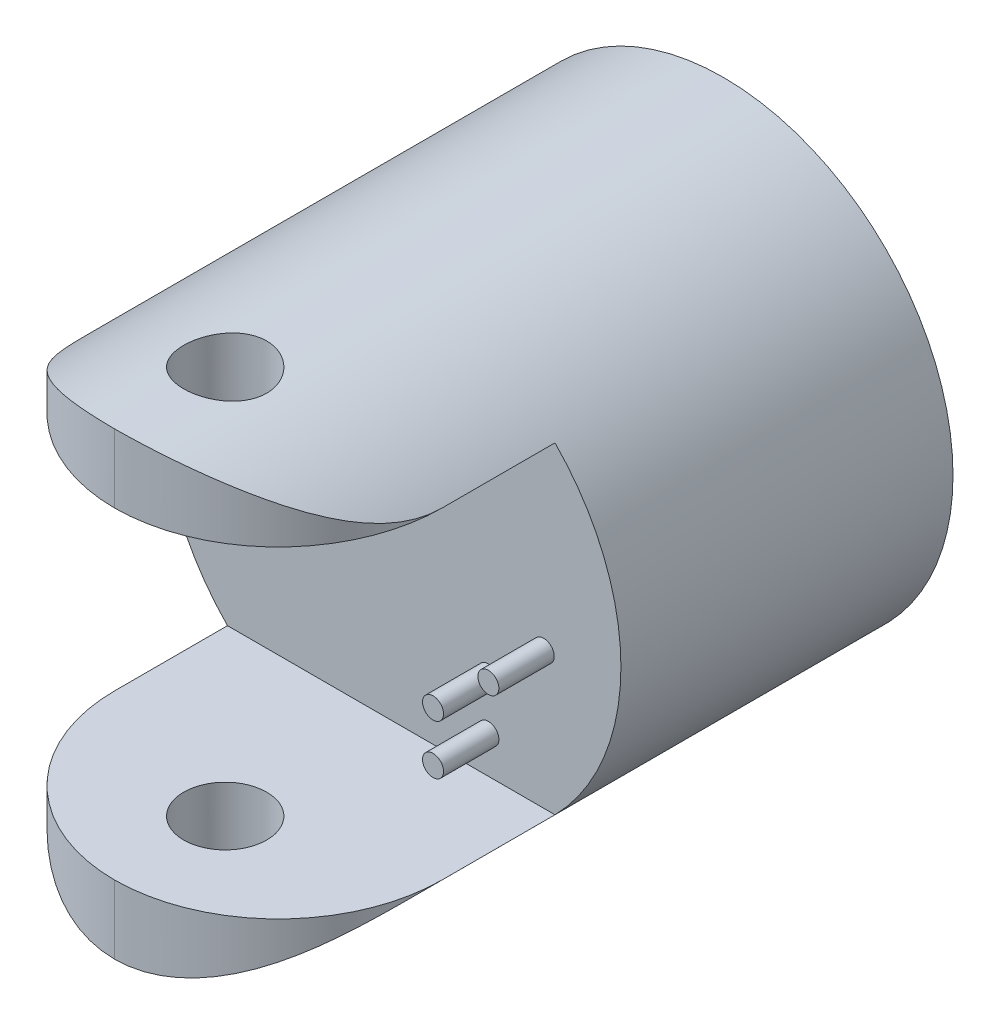
ISO-10303-21;
HEADER;
FILE_DESCRIPTION(('STEP AP214'),'2;1');
FILE_NAME('part.step','',(''),(''),'','','');
FILE_SCHEMA(('AUTOMOTIVE_DESIGN { 1 0 10303 214 1 1 1 1 }'));
ENDSEC;
DATA;
#1=APPLICATION_CONTEXT('core data for automotive mechanical design processes');
#2=APPLICATION_PROTOCOL_DEFINITION('international standard','automotive_design',2000,#1);
#3=PRODUCT_CONTEXT('',#1,'mechanical');
#4=PRODUCT('Part','Part','',(#3));
#5=PRODUCT_RELATED_PRODUCT_CATEGORY('part','',(#4));
#6=PRODUCT_DEFINITION_FORMATION('','',#4);
#7=PRODUCT_DEFINITION_CONTEXT('part definition',#1,'design');
#8=PRODUCT_DEFINITION('design','',#6,#7);
#9=PRODUCT_DEFINITION_SHAPE('','',#8);
#10=(LENGTH_UNIT() NAMED_UNIT(*) SI_UNIT(.MILLI.,.METRE.));
#11=(NAMED_UNIT(*) PLANE_ANGLE_UNIT() SI_UNIT($,.RADIAN.));
#12=(NAMED_UNIT(*) SI_UNIT($,.STERADIAN.) SOLID_ANGLE_UNIT());
#13=UNCERTAINTY_MEASURE_WITH_UNIT(LENGTH_MEASURE(1.E-05),#10,'distance_accuracy_value','');
#14=(GEOMETRIC_REPRESENTATION_CONTEXT(3) GLOBAL_UNCERTAINTY_ASSIGNED_CONTEXT((#13)) GLOBAL_UNIT_ASSIGNED_CONTEXT((#10,
#11,#12)) REPRESENTATION_CONTEXT('',''));
#15=CARTESIAN_POINT('',(0.,0.,0.));
#16=DIRECTION('',(0.,0.,1.));
#17=DIRECTION('',(1.,0.,0.));
#18=AXIS2_PLACEMENT_3D('',#15,#16,#17);
#19=CARTESIAN_POINT('',(0.,0.,11.));
#20=DIRECTION('',(0.,0.,-1.));
#21=DIRECTION('',(-1.,0.,0.));
#22=AXIS2_PLACEMENT_3D('',#19,#20,#21);
#23=CYLINDRICAL_SURFACE('',#22,4.15);
#24=CARTESIAN_POINT('',(0.,-4.15,9.75));
#25=CARTESIAN_POINT('',(0.0417633529160029,-4.14999925457705,9.74999837595521));
#26=CARTESIAN_POINT('',(0.0835481573998624,-4.14936304566028,9.74649985761465));
#27=CARTESIAN_POINT('',(0.16594216285283,-4.14688638329894,9.73260615082788));
#28=CARTESIAN_POINT('',(0.206550309547093,-4.1450448827657,9.72220496562846));
#29=CARTESIAN_POINT('',(0.28538732379447,-4.14036381959375,9.69483327201025));
#30=CARTESIAN_POINT('',(0.323618238312349,-4.13752513001491,9.67786850882844));
#31=CARTESIAN_POINT('',(0.396687083534481,-4.13116039085345,9.6378671193461));
#32=CARTESIAN_POINT('',(0.431525326466942,-4.12763440461269,9.61483105251337));
#33=CARTESIAN_POINT('',(0.497212752770685,-4.12024082002977,9.56306781875255));
#34=CARTESIAN_POINT('',(0.528018581262237,-4.11637015929579,9.53428606624225));
#35=CARTESIAN_POINT('',(0.584391836857417,-4.10874643945675,9.4719659209259));
#36=CARTESIAN_POINT('',(0.609958903650842,-4.10499338845566,9.43842720121465));
#37=CARTESIAN_POINT('',(0.655307004822626,-4.09800010398338,9.36724163364887));
#38=CARTESIAN_POINT('',(0.675044348833567,-4.09476382236178,9.32956653095574));
#39=CARTESIAN_POINT('',(0.707893147721324,-4.08921344318258,9.2513670975097));
#40=CARTESIAN_POINT('',(0.72100513173539,-4.08689927198336,9.210842994588));
#41=CARTESIAN_POINT('',(0.740092715047396,-4.08348585189574,9.12855837822476));
#42=CARTESIAN_POINT('',(0.746143674851663,-4.08237378289001,9.08681588836988));
#43=CARTESIAN_POINT('',(0.751171273723279,-4.08145178788948,9.00289445006508));
#44=CARTESIAN_POINT('',(0.750148501724098,-4.08164175349194,8.96071553824202));
#45=CARTESIAN_POINT('',(0.741118870093994,-4.08329068038666,8.87766181100847));
#46=CARTESIAN_POINT('',(0.733197351083193,-4.08473413483305,8.83677736421685));
#47=CARTESIAN_POINT('',(0.71072932815388,-4.08870307040237,8.75692749059363));
#48=CARTESIAN_POINT('',(0.696182560914899,-4.09122859453191,8.71796214010472));
#49=CARTESIAN_POINT('',(0.66079248216571,-4.0970935000125,8.64280489159885));
#50=CARTESIAN_POINT('',(0.639914382004487,-4.10043735773864,8.60662973859554));
#51=CARTESIAN_POINT('',(0.592478925197906,-4.10755915402166,8.53826398939631));
#52=CARTESIAN_POINT('',(0.565921031850152,-4.11133713358454,8.5060737702041));
#53=CARTESIAN_POINT('',(0.507418107741395,-4.11896925292661,8.44609825953213));
#54=CARTESIAN_POINT('',(0.475400004374248,-4.1228236987261,8.41838423611932));
#55=CARTESIAN_POINT('',(0.407130932089405,-4.1301236018889,8.36871051358903));
#56=CARTESIAN_POINT('',(0.370879926253039,-4.13356905568453,8.34675086466565));
#57=CARTESIAN_POINT('',(0.295102220395709,-4.13966899106462,8.30920011019317));
#58=CARTESIAN_POINT('',(0.255571959647319,-4.14232259807895,8.29361603927841));
#59=CARTESIAN_POINT('',(0.174396233387298,-4.14653301374088,8.26932886328801));
#60=CARTESIAN_POINT('',(0.132750976816927,-4.14808993050584,8.26062507990791));
#61=CARTESIAN_POINT('',(0.0491409343128916,-4.14991679826833,8.25044387087086));
#62=CARTESIAN_POINT('',(0.00718841417311272,-4.15020414959385,8.24886873451339));
#63=CARTESIAN_POINT('',(-0.0763806989520892,-4.14950743742769,8.25272797273135));
#64=CARTESIAN_POINT('',(-0.117997307138798,-4.148523431798,8.25816202830443));
#65=CARTESIAN_POINT('',(-0.199406067096915,-4.14540538188906,8.27580414376078));
#66=CARTESIAN_POINT('',(-0.23920920244161,-4.14327967354819,8.28796312174709));
#67=CARTESIAN_POINT('',(-0.316212040501872,-4.13811557383498,8.3186570869092));
#68=CARTESIAN_POINT('',(-0.353411576237733,-4.13507712399073,8.33719248258114));
#69=CARTESIAN_POINT('',(-0.424570777688059,-4.12838120904228,8.38033192813667));
#70=CARTESIAN_POINT('',(-0.458493397504219,-4.12471772814357,8.40499613335158));
#71=CARTESIAN_POINT('',(-0.521753274626184,-4.11719445670148,8.45961122010429));
#72=CARTESIAN_POINT('',(-0.551090135753188,-4.11333464923495,8.48956255793945));
#73=CARTESIAN_POINT('',(-0.604713963648932,-4.10579651162693,8.55434270755456));
#74=CARTESIAN_POINT('',(-0.628934466189848,-4.10212099339999,8.58922691789111));
#75=CARTESIAN_POINT('',(-0.671171804992389,-4.09542276587398,8.66262624916221));
#76=CARTESIAN_POINT('',(-0.689188861253627,-4.09240003342586,8.70114124127264));
#77=CARTESIAN_POINT('',(-0.718411876153673,-4.0873713664744,8.78053433848268));
#78=CARTESIAN_POINT('',(-0.729649180051608,-4.08536075980998,8.82140059641269));
#79=CARTESIAN_POINT('',(-0.745091088372947,-4.08257295352608,8.90448055933978));
#80=CARTESIAN_POINT('',(-0.749296423840621,-4.08179562569522,8.94669412380566));
#81=CARTESIAN_POINT('',(-0.750531922601924,-4.08156856677854,9.03060539079745));
#82=CARTESIAN_POINT('',(-0.747666844440615,-4.0820994524223,9.07230153476153));
#83=CARTESIAN_POINT('',(-0.7350712415114,-4.08438619149733,9.15460762871231));
#84=CARTESIAN_POINT('',(-0.725340751029883,-4.08614203881104,9.19521758412245));
#85=CARTESIAN_POINT('',(-0.699333389112052,-4.09067296457235,9.27414751692534));
#86=CARTESIAN_POINT('',(-0.683067080642614,-4.09344639780702,9.31247107528446));
#87=CARTESIAN_POINT('',(-0.644461025057432,-4.09970129587837,9.38586203191902));
#88=CARTESIAN_POINT('',(-0.62212089134153,-4.1031828057807,9.42092922273537));
#89=CARTESIAN_POINT('',(-0.571633854840698,-4.11052218527481,9.48733832503289));
#90=CARTESIAN_POINT('',(-0.543410422777707,-4.11438462069311,9.51862156055395));
#91=CARTESIAN_POINT('',(-0.482118220757091,-4.12201574599584,9.57604322892614));
#92=CARTESIAN_POINT('',(-0.449048338245757,-4.12578441412201,9.60218047722454));
#93=CARTESIAN_POINT('',(-0.378674791350169,-4.13283983488285,9.64876898116644));
#94=CARTESIAN_POINT('',(-0.341338352534418,-4.1361223409601,9.66917138820752));
#95=CARTESIAN_POINT('',(-0.263721552548611,-4.14179421595991,9.70338189542399));
#96=CARTESIAN_POINT('',(-0.223444056252405,-4.14418444053325,9.71719631667607));
#97=CARTESIAN_POINT('',(-0.152528961625564,-4.14730345772841,9.73496793477864));
#98=CARTESIAN_POINT('',(-0.122311088327403,-4.14830905480851,9.74059553338378));
#99=CARTESIAN_POINT('',(-0.0613993348129784,-4.14965759253691,9.74811212107088));
#100=CARTESIAN_POINT('',(-0.030705465292773,-4.15000054805366,9.75000119403849));
#101=CARTESIAN_POINT('',(0.,-4.15,9.75));
#102=B_SPLINE_CURVE_WITH_KNOTS('',3,(#24,#25,#26,#27,#28,#29,#30,#31,#32,#33,#34,#35,#36,#37,
#38,#39,#40,#41,#42,#43,#44,#45,#46,#47,#48,#49,#50,#51,#52,#53,#54,#55,#56,#57,#58,#59,#60,#61,
#62,#63,#64,#65,#66,#67,#68,#69,#70,#71,#72,#73,#74,#75,#76,#77,#78,#79,#80,#81,#82,#83,#84,#85,
#86,#87,#88,#89,#90,#91,#92,#93,#94,#95,#96,#97,#98,#99,#100,#101),.UNSPECIFIED.,.T.,.F.,(4,2,2,
2,2,2,2,2,2,2,2,2,2,2,2,2,2,2,2,2,2,2,2,2,2,2,2,2,2,2,2,2,2,2,2,2,2,2,4),(0.,0.125177785668832,
0.250464463262718,0.375641722019261,0.500807449780535,0.627224312854514,0.753649867678679,
0.881000173437713,1.00834030670112,1.13430856795446,1.26026634166968,1.38468774464513,
1.50911409318043,1.63423690854279,1.75937155240086,1.88633537321412,2.01330030146741,
2.14040494388113,2.26749705391138,2.39284175946172,2.51818076052509,2.64261682024136,
2.7670608532623,2.89277822831451,3.01850645850924,3.14577923213746,3.27304749168683,
3.39972274253965,3.52638482339947,3.65118151844347,3.77597759024772,3.90057277697189,
4.02517589606128,4.15151415916005,4.27788147009871,4.40529462024447,4.53258527212581,
4.62462118715898,4.71665503705153),.UNSPECIFIED.);
#103=CARTESIAN_POINT('',(0.,-4.15,9.75));
#104=VERTEX_POINT('',#103);
#105=EDGE_CURVE('E161',#104,#104,#102,.T.);
#106=ORIENTED_EDGE('',*,*,#105,.T.);
#107=EDGE_LOOP('',(#106));
#108=FACE_BOUND('',#107,.T.);
#109=CARTESIAN_POINT('',(0.,4.15,9.75));
#110=CARTESIAN_POINT('',(-0.0417633529160019,4.14999925457705,9.74999837595521));
#111=CARTESIAN_POINT('',(-0.0835481573998615,4.14936304566028,9.74649985761465));
#112=CARTESIAN_POINT('',(-0.16594216285283,4.14688638329894,9.73260615082788));
#113=CARTESIAN_POINT('',(-0.206550309547093,4.1450448827657,9.72220496562846));
#114=CARTESIAN_POINT('',(-0.285387323794469,4.14036381959375,9.69483327201025));
#115=CARTESIAN_POINT('',(-0.323618238312348,4.13752513001491,9.67786850882844));
#116=CARTESIAN_POINT('',(-0.39668708353448,4.13116039085345,9.6378671193461));
#117=CARTESIAN_POINT('',(-0.431525326466941,4.12763440461269,9.61483105251337));
#118=CARTESIAN_POINT('',(-0.497212752770685,4.12024082002977,9.56306781875255));
#119=CARTESIAN_POINT('',(-0.528018581262236,4.11637015929579,9.53428606624225));
#120=CARTESIAN_POINT('',(-0.584391836857417,4.10874643945675,9.4719659209259));
#121=CARTESIAN_POINT('',(-0.609958903650842,4.10499338845566,9.43842720121465));
#122=CARTESIAN_POINT('',(-0.655307004822625,4.09800010398338,9.36724163364887));
#123=CARTESIAN_POINT('',(-0.675044348833566,4.09476382236178,9.32956653095573));
#124=CARTESIAN_POINT('',(-0.707893147721324,4.08921344318258,9.2513670975097));
#125=CARTESIAN_POINT('',(-0.721005131735389,4.08689927198336,9.21084299458799));
#126=CARTESIAN_POINT('',(-0.740092715047394,4.08348585189574,9.12855837822475));
#127=CARTESIAN_POINT('',(-0.746143674851661,4.08237378289001,9.08681588836988));
#128=CARTESIAN_POINT('',(-0.751171273723277,4.08145178788948,9.00289445006507));
#129=CARTESIAN_POINT('',(-0.750148501724096,4.08164175349194,8.96071553824201));
#130=CARTESIAN_POINT('',(-0.741118870093992,4.08329068038666,8.87766181100847));
#131=CARTESIAN_POINT('',(-0.733197351083191,4.08473413483305,8.83677736421685));
#132=CARTESIAN_POINT('',(-0.710729328153876,4.08870307040237,8.75692749059363));
#133=CARTESIAN_POINT('',(-0.696182560914895,4.09122859453191,8.71796214010472));
#134=CARTESIAN_POINT('',(-0.660792482165707,4.09709350001251,8.64280489159885));
#135=CARTESIAN_POINT('',(-0.639914382004484,4.10043735773864,8.60662973859554));
#136=CARTESIAN_POINT('',(-0.592478925197904,4.10755915402166,8.53826398939631));
#137=CARTESIAN_POINT('',(-0.56592103185015,4.11133713358454,8.5060737702041));
#138=CARTESIAN_POINT('',(-0.507418107741392,4.11896925292661,8.44609825953213));
#139=CARTESIAN_POINT('',(-0.475400004374245,4.1228236987261,8.41838423611932));
#140=CARTESIAN_POINT('',(-0.407130932089402,4.1301236018889,8.36871051358903));
#141=CARTESIAN_POINT('',(-0.370879926253035,4.13356905568453,8.34675086466565));
#142=CARTESIAN_POINT('',(-0.295102220395705,4.13966899106462,8.30920011019317));
#143=CARTESIAN_POINT('',(-0.255571959647315,4.14232259807895,8.29361603927841));
#144=CARTESIAN_POINT('',(-0.174396233387294,4.14653301374088,8.26932886328801));
#145=CARTESIAN_POINT('',(-0.132750976816923,4.14808993050584,8.26062507990791));
#146=CARTESIAN_POINT('',(-0.0491409343128873,4.14991679826833,8.25044387087086));
#147=CARTESIAN_POINT('',(-0.00718841417310828,4.15020414959385,8.24886873451339));
#148=CARTESIAN_POINT('',(0.0763806989520937,4.14950743742769,8.25272797273135));
#149=CARTESIAN_POINT('',(0.117997307138802,4.148523431798,8.25816202830443));
#150=CARTESIAN_POINT('',(0.19940606709692,4.14540538188906,8.27580414376078));
#151=CARTESIAN_POINT('',(0.239209202441615,4.14327967354819,8.2879631217471));
#152=CARTESIAN_POINT('',(0.316212040501876,4.13811557383498,8.3186570869092));
#153=CARTESIAN_POINT('',(0.353411576237737,4.13507712399073,8.33719248258114));
#154=CARTESIAN_POINT('',(0.424570777688062,4.12838120904228,8.38033192813667));
#155=CARTESIAN_POINT('',(0.458493397504223,4.12471772814357,8.40499613335158));
#156=CARTESIAN_POINT('',(0.521753274626188,4.11719445670148,8.45961122010429));
#157=CARTESIAN_POINT('',(0.551090135753192,4.11333464923495,8.48956255793946));
#158=CARTESIAN_POINT('',(0.604713963648936,4.10579651162692,8.55434270755456));
#159=CARTESIAN_POINT('',(0.628934466189852,4.10212099339999,8.58922691789111));
#160=CARTESIAN_POINT('',(0.671171804992392,4.09542276587398,8.66262624916221));
#161=CARTESIAN_POINT('',(0.68918886125363,4.09240003342586,8.70114124127264));
#162=CARTESIAN_POINT('',(0.718411876153675,4.0873713664744,8.78053433848268));
#163=CARTESIAN_POINT('',(0.72964918005161,4.08536075980998,8.82140059641269));
#164=CARTESIAN_POINT('',(0.745091088372949,4.08257295352608,8.90448055933978));
#165=CARTESIAN_POINT('',(0.749296423840623,4.08179562569522,8.94669412380566));
#166=CARTESIAN_POINT('',(0.750531922601926,4.08156856677854,9.03060539079745));
#167=CARTESIAN_POINT('',(0.747666844440617,4.0820994524223,9.07230153476154));
#168=CARTESIAN_POINT('',(0.735071241511402,4.08438619149733,9.15460762871231));
#169=CARTESIAN_POINT('',(0.725340751029885,4.08614203881104,9.19521758412245));
#170=CARTESIAN_POINT('',(0.699333389112054,4.09067296457235,9.27414751692535));
#171=CARTESIAN_POINT('',(0.683067080642616,4.09344639780702,9.31247107528446));
#172=CARTESIAN_POINT('',(0.644461025057433,4.09970129587837,9.38586203191902));
#173=CARTESIAN_POINT('',(0.622120891341531,4.1031828057807,9.42092922273537));
#174=CARTESIAN_POINT('',(0.5716338548407,4.11052218527481,9.4873383250329));
#175=CARTESIAN_POINT('',(0.543410422777708,4.11438462069311,9.51862156055395));
#176=CARTESIAN_POINT('',(0.482118220757092,4.12201574599584,9.57604322892615));
#177=CARTESIAN_POINT('',(0.449048338245758,4.12578441412201,9.60218047722454));
#178=CARTESIAN_POINT('',(0.378674791350169,4.13283983488285,9.64876898116644));
#179=CARTESIAN_POINT('',(0.341338352534418,4.1361223409601,9.66917138820752));
#180=CARTESIAN_POINT('',(0.26372155254861,4.14179421595991,9.70338189542399));
#181=CARTESIAN_POINT('',(0.223444056252404,4.14418444053325,9.71719631667607));
#182=CARTESIAN_POINT('',(0.152528961625563,4.14730345772841,9.73496793477865));
#183=CARTESIAN_POINT('',(0.122311088327403,4.14830905480851,9.74059553338378));
#184=CARTESIAN_POINT('',(0.061399334812979,4.14965759253691,9.74811212107088));
#185=CARTESIAN_POINT('',(0.0307054652927739,4.15000054805366,9.75000119403849));
#186=CARTESIAN_POINT('',(0.,4.15,9.75));
#187=B_SPLINE_CURVE_WITH_KNOTS('',3,(#109,#110,#111,#112,#113,#114,#115,#116,#117,#118,#119,
#120,#121,#122,#123,#124,#125,#126,#127,#128,#129,#130,#131,#132,#133,#134,#135,#136,#137,#138,
#139,#140,#141,#142,#143,#144,#145,#146,#147,#148,#149,#150,#151,#152,#153,#154,#155,#156,#157,
#158,#159,#160,#161,#162,#163,#164,#165,#166,#167,#168,#169,#170,#171,#172,#173,#174,#175,#176,
#177,#178,#179,#180,#181,#182,#183,#184,#185,#186),.UNSPECIFIED.,.T.,.F.,(4,2,2,2,2,2,2,2,2,2,2,
2,2,2,2,2,2,2,2,2,2,2,2,2,2,2,2,2,2,2,2,2,2,2,2,2,2,2,4),(0.,0.125177785668832,
0.250464463262719,0.375641722019262,0.500807449780535,0.627224312854516,0.753649867678682,
0.881000173437716,1.00834030670112,1.13430856795446,1.26026634166968,1.38468774464514,
1.50911409318043,1.63423690854279,1.75937155240086,1.88633537321412,2.01330030146741,
2.14040494388113,2.26749705391138,2.39284175946172,2.51818076052509,2.64261682024137,
2.7670608532623,2.89277822831451,3.01850645850924,3.14577923213746,3.27304749168683,
3.39972274253965,3.52638482339947,3.65118151844348,3.77597759024772,3.90057277697189,
4.02517589606128,4.15151415916005,4.27788147009871,4.40529462024447,4.53258527212582,
4.62462118715899,4.71665503705153),.UNSPECIFIED.);
#188=CARTESIAN_POINT('',(0.,4.15,9.75));
#189=VERTEX_POINT('',#188);
#190=EDGE_CURVE('E168',#189,#189,#187,.T.);
#191=ORIENTED_EDGE('',*,*,#190,.T.);
#192=EDGE_LOOP('',(#191));
#193=FACE_BOUND('',#192,.T.);
#194=CARTESIAN_POINT('',(0.,0.,0.));
#195=DIRECTION('',(0.,0.,1.));
#196=DIRECTION('',(1.,0.,0.));
#197=AXIS2_PLACEMENT_3D('',#194,#195,#196);
#198=CIRCLE('',#197,4.15);
#199=CARTESIAN_POINT('',(4.15,0.,0.));
#200=VERTEX_POINT('',#199);
#201=EDGE_CURVE('E245',#200,#200,#198,.T.);
#202=ORIENTED_EDGE('',*,*,#201,.T.);
#203=EDGE_LOOP('',(#202));
#204=FACE_BOUND('',#203,.T.);
#205=CARTESIAN_POINT('',(0.,-4.15,11.));
#206=CARTESIAN_POINT('',(0.0737710438092177,-4.15001637838117,10.9997711551872));
#207=CARTESIAN_POINT('',(0.147521201769732,-4.14803345653216,10.99676270152));
#208=CARTESIAN_POINT('',(0.294346500492553,-4.14019632914525,10.9853060322088));
#209=CARTESIAN_POINT('',(0.367422028584731,-4.13434450578319,10.9768611639802));
#210=CARTESIAN_POINT('',(0.511887402617196,-4.11894665875819,10.9547225205739));
#211=CARTESIAN_POINT('',(0.583285103683018,-4.10942482115206,10.9410631156433));
#212=CARTESIAN_POINT('',(0.72435953305299,-4.08691982179545,10.9087089469047));
#213=CARTESIAN_POINT('',(0.794036078560022,-4.07393629410486,10.8900136507435));
#214=CARTESIAN_POINT('',(0.999488999223939,-4.03026470619419,10.8268300846651));
#215=CARTESIAN_POINT('',(1.13213265403816,-3.99480575159726,10.7751741276439));
#216=CARTESIAN_POINT('',(1.38628515982707,-3.91389653891575,10.6550253532503));
#217=CARTESIAN_POINT('',(1.5077786462865,-3.86843277903603,10.5865097683757));
#218=CARTESIAN_POINT('',(1.74842025205155,-3.76617869199487,10.4280300778353));
#219=CARTESIAN_POINT('',(1.86638398378446,-3.70873864338606,10.3366946673777));
#220=CARTESIAN_POINT('',(2.08640389212964,-3.5895808933294,10.1386427255982));
#221=CARTESIAN_POINT('',(2.18843789336242,-3.52785739854,10.03190514385));
#222=CARTESIAN_POINT('',(2.33740974169363,-3.42978457608745,9.85094799280366));
#223=CARTESIAN_POINT('',(2.38984257798634,-3.39335666580099,9.78122759289409));
#224=CARTESIAN_POINT('',(2.48860984336442,-3.32160438987885,9.63706124590727));
#225=CARTESIAN_POINT('',(2.53494255770604,-3.28628033665637,9.56261397878809));
#226=CARTESIAN_POINT('',(2.66425880071868,-3.18374592760514,9.33248943101517));
#227=CARTESIAN_POINT('',(2.73783538659976,-3.11978313275751,9.16969771007274));
#228=CARTESIAN_POINT('',(2.83711038398212,-3.02924663837947,8.88166848303728));
#229=CARTESIAN_POINT('',(2.87059054909473,-2.99724359561824,8.76078791002892));
#230=CARTESIAN_POINT('',(2.92213370312873,-2.94702637355634,8.51317669646417));
#231=CARTESIAN_POINT('',(2.94025175663548,-2.92876297209598,8.38646868128149));
#232=CARTESIAN_POINT('',(2.95297303571592,-2.91589713460381,8.22091985462587));
#233=CARTESIAN_POINT('',(2.95514942372137,-2.91369074108684,8.18309475851005));
#234=CARTESIAN_POINT('',(2.95805399318249,-2.91074273792794,8.10732312672854));
#235=CARTESIAN_POINT('',(2.95878183133762,-2.91000147551654,8.06937656440961));
#236=CARTESIAN_POINT('',(2.95878353381926,-2.91,8.03141447824052));
#237=B_SPLINE_CURVE_WITH_KNOTS('',3,(#205,#206,#207,#208,#209,#210,#211,#212,#213,#214,#215,
#216,#217,#218,#219,#220,#221,#222,#223,#224,#225,#226,#227,#228,#229,#230,#231,#232,#233,#234,
#235,#236),.UNSPECIFIED.,.F.,.F.,(4,2,2,2,2,2,2,2,2,2,2,2,2,2,2,4),(0.,0.221216659332027,
0.442297236931716,0.661945099887195,0.881616191338399,1.3196191594544,1.75821689120952,
2.23609248859874,2.71462750436423,2.99793291530304,3.28131779410793,3.8466908147584,
4.23368032536052,4.61927675904671,4.73309124623172,4.84693270378588),.UNSPECIFIED.);
#238=CARTESIAN_POINT('',(0.,-4.15,11.));
#239=VERTEX_POINT('',#238);
#240=CARTESIAN_POINT('',(2.95878353381926,-2.91,8.03141447824052));
#241=VERTEX_POINT('',#240);
#242=EDGE_CURVE('E95',#239,#241,#237,.T.);
#243=ORIENTED_EDGE('',*,*,#242,.F.);
#244=CARTESIAN_POINT('',(0.,-4.15,11.));
#245=CARTESIAN_POINT('',(-0.0737710438092177,-4.15001637838117,10.9997711551872));
#246=CARTESIAN_POINT('',(-0.147521201769732,-4.14803345653216,10.99676270152));
#247=CARTESIAN_POINT('',(-0.294346500492553,-4.14019632914525,10.9853060322088));
#248=CARTESIAN_POINT('',(-0.367422028584731,-4.13434450578319,10.9768611639802));
#249=CARTESIAN_POINT('',(-0.511887402617196,-4.11894665875819,10.9547225205739));
#250=CARTESIAN_POINT('',(-0.583285103683018,-4.10942482115206,10.9410631156433));
#251=CARTESIAN_POINT('',(-0.72435953305299,-4.08691982179545,10.9087089469047));
#252=CARTESIAN_POINT('',(-0.794036078560022,-4.07393629410486,10.8900136507435));
#253=CARTESIAN_POINT('',(-0.999488999223939,-4.03026470619419,10.8268300846651));
#254=CARTESIAN_POINT('',(-1.13213265403816,-3.99480575159726,10.7751741276439));
#255=CARTESIAN_POINT('',(-1.38628515982707,-3.91389653891575,10.6550253532503));
#256=CARTESIAN_POINT('',(-1.5077786462865,-3.86843277903603,10.5865097683757));
#257=CARTESIAN_POINT('',(-1.74842025205155,-3.76617869199487,10.4280300778353));
#258=CARTESIAN_POINT('',(-1.86638398378446,-3.70873864338606,10.3366946673777));
#259=CARTESIAN_POINT('',(-2.08640389212964,-3.5895808933294,10.1386427255982));
#260=CARTESIAN_POINT('',(-2.18843789336242,-3.52785739854,10.03190514385));
#261=CARTESIAN_POINT('',(-2.33740974169363,-3.42978457608745,9.85094799280366));
#262=CARTESIAN_POINT('',(-2.38984257798634,-3.39335666580099,9.78122759289409));
#263=CARTESIAN_POINT('',(-2.48860984336442,-3.32160438987885,9.63706124590727));
#264=CARTESIAN_POINT('',(-2.53494255770604,-3.28628033665637,9.56261397878809));
#265=CARTESIAN_POINT('',(-2.66425880071868,-3.18374592760514,9.33248943101517));
#266=CARTESIAN_POINT('',(-2.73783538659976,-3.11978313275751,9.16969771007274));
#267=CARTESIAN_POINT('',(-2.83711038398212,-3.02924663837947,8.88166848303728));
#268=CARTESIAN_POINT('',(-2.87059054909473,-2.99724359561824,8.76078791002892));
#269=CARTESIAN_POINT('',(-2.92213370312873,-2.94702637355634,8.51317669646417));
#270=CARTESIAN_POINT('',(-2.94025175663548,-2.92876297209598,8.38646868128149));
#271=CARTESIAN_POINT('',(-2.95297303571592,-2.91589713460381,8.22091985462587));
#272=CARTESIAN_POINT('',(-2.95514942372137,-2.91369074108684,8.18309475851005));
#273=CARTESIAN_POINT('',(-2.95805399318249,-2.91074273792794,8.10732312672854));
#274=CARTESIAN_POINT('',(-2.95878183133762,-2.91000147551654,8.06937656440961));
#275=CARTESIAN_POINT('',(-2.95878353381926,-2.91,8.03141447824052));
#276=B_SPLINE_CURVE_WITH_KNOTS('',3,(#244,#245,#246,#247,#248,#249,#250,#251,#252,#253,#254,
#255,#256,#257,#258,#259,#260,#261,#262,#263,#264,#265,#266,#267,#268,#269,#270,#271,#272,#273,
#274,#275),.UNSPECIFIED.,.F.,.F.,(4,2,2,2,2,2,2,2,2,2,2,2,2,2,2,4),(0.,0.221216659332027,
0.442297236931716,0.661945099887195,0.881616191338399,1.3196191594544,1.75821689120952,
2.23609248859874,2.71462750436423,2.99793291530304,3.28131779410793,3.8466908147584,
4.23368032536052,4.61927675904671,4.73309124623172,4.84693270378588),.UNSPECIFIED.);
#277=CARTESIAN_POINT('',(-2.95878353381926,-2.91,8.03141447824052));
#278=VERTEX_POINT('',#277);
#279=EDGE_CURVE('E105',#239,#278,#276,.T.);
#280=ORIENTED_EDGE('',*,*,#279,.T.);
#281=DIRECTION('',(0.,0.,-1.));
#282=VECTOR('',#281,1.);
#283=CARTESIAN_POINT('',(-2.95878353381926,-2.91,11.));
#284=LINE('',#283,#282);
#285=CARTESIAN_POINT('',(-2.95878353381926,-2.91,6.));
#286=VERTEX_POINT('',#285);
#287=EDGE_CURVE('E249',#278,#286,#284,.T.);
#288=ORIENTED_EDGE('',*,*,#287,.T.);
#289=CARTESIAN_POINT('',(0.,0.,6.));
#290=DIRECTION('',(0.,0.,1.));
#291=DIRECTION('',(1.,0.,0.));
#292=AXIS2_PLACEMENT_3D('',#289,#290,#291);
#293=CIRCLE('',#292,4.15);
#294=CARTESIAN_POINT('',(-2.95878353381926,2.91,6.));
#295=VERTEX_POINT('',#294);
#296=EDGE_CURVE('E49',#295,#286,#293,.T.);
#297=ORIENTED_EDGE('',*,*,#296,.F.);
#298=DIRECTION('',(0.,0.,-1.));
#299=VECTOR('',#298,1.);
#300=CARTESIAN_POINT('',(-2.95878353381926,2.91,11.));
#301=LINE('',#300,#299);
#302=CARTESIAN_POINT('',(-2.95878353381926,2.91,8.03141447824052));
#303=VERTEX_POINT('',#302);
#304=EDGE_CURVE('E262',#295,#303,#301,.F.);
#305=ORIENTED_EDGE('',*,*,#304,.T.);
#306=CARTESIAN_POINT('',(-2.95878353381926,2.91,8.03141447824052));
#307=CARTESIAN_POINT('',(-2.95880448004886,2.90995183640669,8.1027879647433));
#308=CARTESIAN_POINT('',(-2.95621051014669,2.9126159399327,8.17412992085236));
#309=CARTESIAN_POINT('',(-2.94596291749214,2.92299445578679,8.31596184991976));
#310=CARTESIAN_POINT('',(-2.93831789947118,2.93070027905813,8.38645306456915));
#311=CARTESIAN_POINT('',(-2.91825299956732,2.95067520974915,8.52524173195319));
#312=CARTESIAN_POINT('',(-2.90588884877876,2.96289100309475,8.593555068307));
#313=CARTESIAN_POINT('',(-2.87663632977495,2.99130101503771,8.72836326105834));
#314=CARTESIAN_POINT('',(-2.85974623461355,3.00749675204991,8.79485741262108));
#315=CARTESIAN_POINT('',(-2.80294428653934,3.06082998855884,8.99019186581678));
#316=CARTESIAN_POINT('',(-2.75674566861068,3.10287896964202,9.11591227485236));
#317=CARTESIAN_POINT('',(-2.64928447720097,3.1951237352854,9.35783519910247));
#318=CARTESIAN_POINT('',(-2.58797205220744,3.24534628948729,9.47400448466646));
#319=CARTESIAN_POINT('',(-2.43914968201157,3.35906812665182,9.71631226910904));
#320=CARTESIAN_POINT('',(-2.34890268391423,3.42332018045654,9.84041703192992));
#321=CARTESIAN_POINT('',(-2.15022902530512,3.55147830186296,10.0735312310014));
#322=CARTESIAN_POINT('',(-2.04179072011442,3.61538412060928,10.1825309160064));
#323=CARTESIAN_POINT('',(-1.85591355317695,3.71270073499287,10.3422327541768));
#324=CARTESIAN_POINT('',(-1.784070568336,3.74784269277337,10.3984725462494));
#325=CARTESIAN_POINT('',(-1.63465547380158,3.81537833123037,10.5046093973319));
#326=CARTESIAN_POINT('',(-1.557086095143,3.84777330636136,10.5545094493894));
#327=CARTESIAN_POINT('',(-1.39672325342562,3.90883744599436,10.6472888326609));
#328=CARTESIAN_POINT('',(-1.31394212410288,3.93751494950636,10.6901839355711));
#329=CARTESIAN_POINT('',(-1.14355575564298,3.99032865309213,10.7684017913843));
#330=CARTESIAN_POINT('',(-1.05595461963691,4.0144686408075,10.8037308634127));
#331=CARTESIAN_POINT('',(-0.890399036029391,4.0541066624906,10.8613727158644));
#332=CARTESIAN_POINT('',(-0.813030826964371,4.07036265185339,10.884851431402));
#333=CARTESIAN_POINT('',(-0.655917709387011,4.09861465243549,10.9255422558318));
#334=CARTESIAN_POINT('',(-0.576173540261119,4.11061197422727,10.9427562926724));
#335=CARTESIAN_POINT('',(-0.414204338380105,4.13008896313452,10.9707356217683));
#336=CARTESIAN_POINT('',(-0.331962761303898,4.13752376614418,10.9814368642854));
#337=CARTESIAN_POINT('',(-0.166491545547434,4.14749545199079,10.9959476677607));
#338=CARTESIAN_POINT('',(-0.0832609235473489,4.150026962678,10.9997496694789));
#339=CARTESIAN_POINT('',(0.,4.15,11.));
#340=B_SPLINE_CURVE_WITH_KNOTS('',3,(#306,#307,#308,#309,#310,#311,#312,#313,#314,#315,#316,
#317,#318,#319,#320,#321,#322,#323,#324,#325,#326,#327,#328,#329,#330,#331,#332,#333,#334,#335,
#336,#337,#338,#339),.UNSPECIFIED.,.F.,.F.,(4,2,2,2,2,2,2,2,2,2,2,2,2,2,2,2,4),(0.,
0.213972998516877,0.427582419190025,0.638743568567948,0.849985404859294,1.26935140331235,
1.69011959833937,2.18746944675652,2.68513888376047,2.97810242795373,3.27092714339276,
3.56308319024985,3.85499426937874,4.1020475277186,4.34902469125377,4.59839306328995,
4.84803449433509),.UNSPECIFIED.);
#341=CARTESIAN_POINT('',(0.,4.15,11.));
#342=VERTEX_POINT('',#341);
#343=EDGE_CURVE('E64',#303,#342,#340,.T.);
#344=ORIENTED_EDGE('',*,*,#343,.T.);
#345=CARTESIAN_POINT('',(2.95878353381926,2.91,8.03141447824052));
#346=CARTESIAN_POINT('',(2.95880448004886,2.90995183640669,8.1027879647433));
#347=CARTESIAN_POINT('',(2.95621051014669,2.9126159399327,8.17412992085236));
#348=CARTESIAN_POINT('',(2.94596291749214,2.92299445578679,8.31596184991976));
#349=CARTESIAN_POINT('',(2.93831789947118,2.93070027905813,8.38645306456915));
#350=CARTESIAN_POINT('',(2.91825299956732,2.95067520974915,8.52524173195319));
#351=CARTESIAN_POINT('',(2.90588884877876,2.96289100309475,8.593555068307));
#352=CARTESIAN_POINT('',(2.87663632977495,2.99130101503771,8.72836326105834));
#353=CARTESIAN_POINT('',(2.85974623461355,3.00749675204991,8.79485741262108));
#354=CARTESIAN_POINT('',(2.80294428653934,3.06082998855884,8.99019186581678));
#355=CARTESIAN_POINT('',(2.75674566861068,3.10287896964202,9.11591227485236));
#356=CARTESIAN_POINT('',(2.64928447720097,3.1951237352854,9.35783519910247));
#357=CARTESIAN_POINT('',(2.58797205220744,3.24534628948729,9.47400448466646));
#358=CARTESIAN_POINT('',(2.43914968201157,3.35906812665182,9.71631226910904));
#359=CARTESIAN_POINT('',(2.34890268391423,3.42332018045654,9.84041703192992));
#360=CARTESIAN_POINT('',(2.15022902530512,3.55147830186296,10.0735312310014));
#361=CARTESIAN_POINT('',(2.04179072011442,3.61538412060928,10.1825309160064));
#362=CARTESIAN_POINT('',(1.85591355317695,3.71270073499287,10.3422327541768));
#363=CARTESIAN_POINT('',(1.784070568336,3.74784269277337,10.3984725462494));
#364=CARTESIAN_POINT('',(1.63465547380158,3.81537833123037,10.5046093973319));
#365=CARTESIAN_POINT('',(1.557086095143,3.84777330636136,10.5545094493894));
#366=CARTESIAN_POINT('',(1.39672325342562,3.90883744599436,10.6472888326609));
#367=CARTESIAN_POINT('',(1.31394212410288,3.93751494950636,10.6901839355711));
#368=CARTESIAN_POINT('',(1.14355575564298,3.99032865309213,10.7684017913843));
#369=CARTESIAN_POINT('',(1.05595461963691,4.0144686408075,10.8037308634127));
#370=CARTESIAN_POINT('',(0.890399036029391,4.0541066624906,10.8613727158644));
#371=CARTESIAN_POINT('',(0.813030826964371,4.07036265185339,10.884851431402));
#372=CARTESIAN_POINT('',(0.655917709387011,4.09861465243549,10.9255422558318));
#373=CARTESIAN_POINT('',(0.576173540261119,4.11061197422727,10.9427562926724));
#374=CARTESIAN_POINT('',(0.414204338380105,4.13008896313452,10.9707356217683));
#375=CARTESIAN_POINT('',(0.331962761303898,4.13752376614418,10.9814368642854));
#376=CARTESIAN_POINT('',(0.166491545547434,4.14749545199079,10.9959476677607));
#377=CARTESIAN_POINT('',(0.0832609235473489,4.150026962678,10.9997496694789));
#378=CARTESIAN_POINT('',(0.,4.15,11.));
#379=B_SPLINE_CURVE_WITH_KNOTS('',3,(#345,#346,#347,#348,#349,#350,#351,#352,#353,#354,#355,
#356,#357,#358,#359,#360,#361,#362,#363,#364,#365,#366,#367,#368,#369,#370,#371,#372,#373,#374,
#375,#376,#377,#378),.UNSPECIFIED.,.F.,.F.,(4,2,2,2,2,2,2,2,2,2,2,2,2,2,2,2,4),(0.,
0.213972998516877,0.427582419190025,0.638743568567948,0.849985404859294,1.26935140331235,
1.69011959833937,2.18746944675652,2.68513888376047,2.97810242795373,3.27092714339276,
3.56308319024985,3.85499426937874,4.1020475277186,4.34902469125377,4.59839306328995,
4.84803449433509),.UNSPECIFIED.);
#380=CARTESIAN_POINT('',(2.95878353381926,2.91,8.03141447824052));
#381=VERTEX_POINT('',#380);
#382=EDGE_CURVE('E151',#381,#342,#379,.T.);
#383=ORIENTED_EDGE('',*,*,#382,.F.);
#384=DIRECTION('',(0.,0.,-1.));
#385=VECTOR('',#384,1.);
#386=CARTESIAN_POINT('',(2.95878353381926,2.91,11.));
#387=LINE('',#386,#385);
#388=CARTESIAN_POINT('',(2.95878353381926,2.91,6.));
#389=VERTEX_POINT('',#388);
#390=EDGE_CURVE('E259',#381,#389,#387,.T.);
#391=ORIENTED_EDGE('',*,*,#390,.T.);
#392=CARTESIAN_POINT('',(2.95878353381926,-2.91,6.));
#393=VERTEX_POINT('',#392);
#394=EDGE_CURVE('E248',#393,#389,#293,.T.);
#395=ORIENTED_EDGE('',*,*,#394,.F.);
#396=DIRECTION('',(0.,0.,-1.));
#397=VECTOR('',#396,1.);
#398=CARTESIAN_POINT('',(2.95878353381926,-2.91,11.));
#399=LINE('',#398,#397);
#400=EDGE_CURVE('E108',#393,#241,#399,.F.);
#401=ORIENTED_EDGE('',*,*,#400,.T.);
#402=EDGE_LOOP('',(#243,#280,#288,#297,#305,#344,#383,#391,#395,#401));
#403=FACE_BOUND('',#402,.T.);
#404=ADVANCED_FACE('F39',(#108,#193,#204,#403),#23,.T.);
#405=CARTESIAN_POINT('',(-4.187555529709,-2.91,6.));
#406=DIRECTION('',(0.,-1.,0.));
#407=DIRECTION('',(0.,0.,-1.));
#408=AXIS2_PLACEMENT_3D('',#405,#406,#407);
#409=PLANE('',#408);
#410=CARTESIAN_POINT('',(0.,-2.91,9.));
#411=DIRECTION('',(0.,-1.,0.));
#412=DIRECTION('',(0.,0.,-1.));
#413=AXIS2_PLACEMENT_3D('',#410,#411,#412);
#414=CIRCLE('',#413,0.75);
#415=CARTESIAN_POINT('',(0.,-2.91,8.25));
#416=VERTEX_POINT('',#415);
#417=EDGE_CURVE('E282',#416,#416,#414,.T.);
#418=ORIENTED_EDGE('',*,*,#417,.T.);
#419=EDGE_LOOP('',(#418));
#420=FACE_BOUND('',#419,.T.);
#421=CARTESIAN_POINT('',(-0.00981822416812848,-2.91,8.03141447824052));
#422=DIRECTION('',(0.,-1.,0.));
#423=DIRECTION('',(0.,0.,-1.));
#424=AXIS2_PLACEMENT_3D('',#421,#422,#423);
#425=CIRCLE('',#424,2.96860175798739);
#426=CARTESIAN_POINT('',(0.,-2.91,11.));
#427=VERTEX_POINT('',#426);
#428=EDGE_CURVE('E56',#241,#427,#425,.T.);
#429=ORIENTED_EDGE('',*,*,#428,.F.);
#430=ORIENTED_EDGE('',*,*,#400,.F.);
#431=DIRECTION('',(1.,0.,0.));
#432=VECTOR('',#431,1.);
#433=CARTESIAN_POINT('',(-4.187555529709,-2.91,6.));
#434=LINE('',#433,#432);
#435=EDGE_CURVE('E119',#286,#393,#434,.T.);
#436=ORIENTED_EDGE('',*,*,#435,.F.);
#437=ORIENTED_EDGE('',*,*,#287,.F.);
#438=CARTESIAN_POINT('',(0.00981822416812848,-2.91,8.03141447824052));
#439=DIRECTION('',(0.,-1.,0.));
#440=DIRECTION('',(0.,0.,-1.));
#441=AXIS2_PLACEMENT_3D('',#438,#439,#440);
#442=CIRCLE('',#441,2.96860175798739);
#443=EDGE_CURVE('E112',#278,#427,#442,.F.);
#444=ORIENTED_EDGE('',*,*,#443,.T.);
#445=EDGE_LOOP('',(#429,#430,#436,#437,#444));
#446=FACE_BOUND('',#445,.T.);
#447=ADVANCED_FACE('F231',(#420,#446),#409,.F.);
#448=CARTESIAN_POINT('',(-4.187555529709,2.91,6.));
#449=DIRECTION('',(0.,1.,0.));
#450=DIRECTION('',(0.,0.,1.));
#451=AXIS2_PLACEMENT_3D('',#448,#449,#450);
#452=PLANE('',#451);
#453=CARTESIAN_POINT('',(0.,2.91,9.));
#454=DIRECTION('',(0.,1.,0.));
#455=DIRECTION('',(0.,0.,1.));
#456=AXIS2_PLACEMENT_3D('',#453,#454,#455);
#457=CIRCLE('',#456,0.75);
#458=CARTESIAN_POINT('',(0.,2.91,9.75));
#459=VERTEX_POINT('',#458);
#460=EDGE_CURVE('E43',#459,#459,#457,.T.);
#461=ORIENTED_EDGE('',*,*,#460,.T.);
#462=EDGE_LOOP('',(#461));
#463=FACE_BOUND('',#462,.T.);
#464=CARTESIAN_POINT('',(-0.00981822416812848,2.91,8.03141447824052));
#465=DIRECTION('',(0.,1.,0.));
#466=DIRECTION('',(0.,0.,1.));
#467=AXIS2_PLACEMENT_3D('',#464,#465,#466);
#468=CIRCLE('',#467,2.96860175798739);
#469=CARTESIAN_POINT('',(0.,2.91,11.));
#470=VERTEX_POINT('',#469);
#471=EDGE_CURVE('E158',#470,#381,#468,.T.);
#472=ORIENTED_EDGE('',*,*,#471,.F.);
#473=CARTESIAN_POINT('',(0.00981822416812848,2.91,8.03141447824052));
#474=DIRECTION('',(0.,1.,0.));
#475=DIRECTION('',(0.,0.,1.));
#476=AXIS2_PLACEMENT_3D('',#473,#474,#475);
#477=CIRCLE('',#476,2.96860175798739);
#478=EDGE_CURVE('E11',#470,#303,#477,.F.);
#479=ORIENTED_EDGE('',*,*,#478,.T.);
#480=ORIENTED_EDGE('',*,*,#304,.F.);
#481=DIRECTION('',(-1.,0.,0.));
#482=VECTOR('',#481,1.);
#483=CARTESIAN_POINT('',(-4.187555529709,2.91,6.));
#484=LINE('',#483,#482);
#485=EDGE_CURVE('E114',#389,#295,#484,.T.);
#486=ORIENTED_EDGE('',*,*,#485,.F.);
#487=ORIENTED_EDGE('',*,*,#390,.F.);
#488=EDGE_LOOP('',(#472,#479,#480,#486,#487));
#489=FACE_BOUND('',#488,.T.);
#490=ADVANCED_FACE('F236',(#463,#489),#452,.F.);
#491=CARTESIAN_POINT('',(0.,0.,0.));
#492=DIRECTION('',(0.,0.,1.));
#493=DIRECTION('',(1.,0.,0.));
#494=AXIS2_PLACEMENT_3D('',#491,#492,#493);
#495=PLANE('',#494);
#496=ORIENTED_EDGE('',*,*,#201,.F.);
#497=EDGE_LOOP('',(#496));
#498=FACE_BOUND('',#497,.T.);
#499=ADVANCED_FACE('F338',(#498),#495,.F.);
#500=CARTESIAN_POINT('',(0.,0.,6.));
#501=DIRECTION('',(0.,0.,1.));
#502=DIRECTION('',(1.,0.,0.));
#503=AXIS2_PLACEMENT_3D('',#500,#501,#502);
#504=PLANE('',#503);
#505=CARTESIAN_POINT('',(2.755,-0.440000000000004,6.));
#506=DIRECTION('',(0.,0.,1.));
#507=DIRECTION('',(1.,0.,0.));
#508=AXIS2_PLACEMENT_3D('',#505,#506,#507);
#509=CIRCLE('',#508,0.19);
#510=CARTESIAN_POINT('',(2.945,-0.440000000000004,6.));
#511=VERTEX_POINT('',#510);
#512=EDGE_CURVE('E329',#511,#511,#509,.T.);
#513=ORIENTED_EDGE('',*,*,#512,.F.);
#514=EDGE_LOOP('',(#513));
#515=FACE_BOUND('',#514,.T.);
#516=CARTESIAN_POINT('',(-2.755,0.459999999999996,6.));
#517=DIRECTION('',(0.,0.,1.));
#518=DIRECTION('',(1.,0.,0.));
#519=AXIS2_PLACEMENT_3D('',#516,#517,#518);
#520=CIRCLE('',#519,0.19);
#521=CARTESIAN_POINT('',(-2.565,0.459999999999996,6.));
#522=VERTEX_POINT('',#521);
#523=EDGE_CURVE('E322',#522,#522,#520,.T.);
#524=ORIENTED_EDGE('',*,*,#523,.F.);
#525=EDGE_LOOP('',(#524));
#526=FACE_BOUND('',#525,.T.);
#527=CARTESIAN_POINT('',(1.755,-2.24,6.));
#528=DIRECTION('',(0.,0.,1.));
#529=DIRECTION('',(1.,0.,0.));
#530=AXIS2_PLACEMENT_3D('',#527,#528,#529);
#531=CIRCLE('',#530,0.19);
#532=CARTESIAN_POINT('',(1.945,-2.24,6.));
#533=VERTEX_POINT('',#532);
#534=EDGE_CURVE('E314',#533,#533,#531,.T.);
#535=ORIENTED_EDGE('',*,*,#534,.F.);
#536=EDGE_LOOP('',(#535));
#537=FACE_BOUND('',#536,.T.);
#538=CARTESIAN_POINT('',(1.755,-1.34,6.));
#539=DIRECTION('',(0.,0.,1.));
#540=DIRECTION('',(1.,0.,0.));
#541=AXIS2_PLACEMENT_3D('',#538,#539,#540);
#542=CIRCLE('',#541,0.19);
#543=CARTESIAN_POINT('',(1.945,-1.34,6.));
#544=VERTEX_POINT('',#543);
#545=EDGE_CURVE('E306',#544,#544,#542,.T.);
#546=ORIENTED_EDGE('',*,*,#545,.F.);
#547=EDGE_LOOP('',(#546));
#548=FACE_BOUND('',#547,.T.);
#549=CARTESIAN_POINT('',(-1.755,1.36,6.));
#550=DIRECTION('',(0.,0.,1.));
#551=DIRECTION('',(1.,0.,0.));
#552=AXIS2_PLACEMENT_3D('',#549,#550,#551);
#553=CIRCLE('',#552,0.19);
#554=CARTESIAN_POINT('',(-1.565,1.36,6.));
#555=VERTEX_POINT('',#554);
#556=EDGE_CURVE('E298',#555,#555,#553,.T.);
#557=ORIENTED_EDGE('',*,*,#556,.F.);
#558=EDGE_LOOP('',(#557));
#559=FACE_BOUND('',#558,.T.);
#560=CARTESIAN_POINT('',(-1.755,2.26,6.));
#561=DIRECTION('',(0.,0.,1.));
#562=DIRECTION('',(1.,0.,0.));
#563=AXIS2_PLACEMENT_3D('',#560,#561,#562);
#564=CIRCLE('',#563,0.19);
#565=CARTESIAN_POINT('',(-1.565,2.26,6.));
#566=VERTEX_POINT('',#565);
#567=EDGE_CURVE('E290',#566,#566,#564,.T.);
#568=ORIENTED_EDGE('',*,*,#567,.F.);
#569=EDGE_LOOP('',(#568));
#570=FACE_BOUND('',#569,.T.);
#571=ORIENTED_EDGE('',*,*,#296,.T.);
#572=ORIENTED_EDGE('',*,*,#435,.T.);
#573=ORIENTED_EDGE('',*,*,#394,.T.);
#574=ORIENTED_EDGE('',*,*,#485,.T.);
#575=EDGE_LOOP('',(#571,#572,#573,#574));
#576=FACE_BOUND('',#575,.T.);
#577=ADVANCED_FACE('F136',(#515,#526,#537,#548,#559,#570,#576),#504,.T.);
#578=CARTESIAN_POINT('',(0.00981822416812848,-4.15,8.03141447824052));
#579=DIRECTION('',(0.,1.,0.));
#580=DIRECTION('',(0.,0.,1.));
#581=AXIS2_PLACEMENT_3D('',#578,#579,#580);
#582=CYLINDRICAL_SURFACE('',#581,2.96860175798739);
#583=ORIENTED_EDGE('',*,*,#478,.F.);
#584=DIRECTION('',(0.,1.,0.));
#585=VECTOR('',#584,1.);
#586=CARTESIAN_POINT('',(0.,-4.15,11.));
#587=LINE('',#586,#585);
#588=EDGE_CURVE('E100',#470,#342,#587,.T.);
#589=ORIENTED_EDGE('',*,*,#588,.T.);
#590=ORIENTED_EDGE('',*,*,#343,.F.);
#591=EDGE_LOOP('',(#583,#589,#590));
#592=FACE_BOUND('',#591,.T.);
#593=ADVANCED_FACE('F133',(#592),#582,.T.);
#594=EDGE_CURVE('E92',#239,#427,#587,.T.);
#595=ORIENTED_EDGE('',*,*,#594,.T.);
#596=ORIENTED_EDGE('',*,*,#443,.F.);
#597=ORIENTED_EDGE('',*,*,#279,.F.);
#598=EDGE_LOOP('',(#595,#596,#597));
#599=FACE_BOUND('',#598,.T.);
#600=ADVANCED_FACE('F111',(#599),#582,.T.);
#601=CARTESIAN_POINT('',(-0.00981822416812848,-4.15,8.03141447824052));
#602=DIRECTION('',(0.,1.,0.));
#603=DIRECTION('',(0.,0.,1.));
#604=AXIS2_PLACEMENT_3D('',#601,#602,#603);
#605=CYLINDRICAL_SURFACE('',#604,2.96860175798739);
#606=ORIENTED_EDGE('',*,*,#242,.T.);
#607=ORIENTED_EDGE('',*,*,#428,.T.);
#608=ORIENTED_EDGE('',*,*,#594,.F.);
#609=EDGE_LOOP('',(#606,#607,#608));
#610=FACE_BOUND('',#609,.T.);
#611=ADVANCED_FACE('F94',(#610),#605,.T.);
#612=ORIENTED_EDGE('',*,*,#382,.T.);
#613=ORIENTED_EDGE('',*,*,#588,.F.);
#614=ORIENTED_EDGE('',*,*,#471,.T.);
#615=EDGE_LOOP('',(#612,#613,#614));
#616=FACE_BOUND('',#615,.T.);
#617=ADVANCED_FACE('F368',(#616),#605,.T.);
#618=CARTESIAN_POINT('',(0.,-4.15,9.));
#619=DIRECTION('',(0.,1.,0.));
#620=DIRECTION('',(0.,0.,1.));
#621=AXIS2_PLACEMENT_3D('',#618,#619,#620);
#622=CYLINDRICAL_SURFACE('',#621,0.75);
#623=ORIENTED_EDGE('',*,*,#460,.F.);
#624=EDGE_LOOP('',(#623));
#625=FACE_BOUND('',#624,.T.);
#626=ORIENTED_EDGE('',*,*,#190,.F.);
#627=EDGE_LOOP('',(#626));
#628=FACE_BOUND('',#627,.T.);
#629=ADVANCED_FACE('F178',(#625,#628),#622,.F.);
#630=ORIENTED_EDGE('',*,*,#417,.F.);
#631=EDGE_LOOP('',(#630));
#632=FACE_BOUND('',#631,.T.);
#633=ORIENTED_EDGE('',*,*,#105,.F.);
#634=EDGE_LOOP('',(#633));
#635=FACE_BOUND('',#634,.T.);
#636=ADVANCED_FACE('F173',(#632,#635),#622,.F.);
#637=CARTESIAN_POINT('',(-1.755,2.26,7.));
#638=DIRECTION('',(0.,0.,-1.));
#639=DIRECTION('',(-1.,0.,0.));
#640=AXIS2_PLACEMENT_3D('',#637,#638,#639);
#641=CYLINDRICAL_SURFACE('',#640,0.19);
#642=CARTESIAN_POINT('',(-1.755,2.26,7.));
#643=DIRECTION('',(0.,0.,1.));
#644=DIRECTION('',(1.,0.,0.));
#645=AXIS2_PLACEMENT_3D('',#642,#643,#644);
#646=CIRCLE('',#645,0.19);
#647=CARTESIAN_POINT('',(-1.565,2.26,7.));
#648=VERTEX_POINT('',#647);
#649=EDGE_CURVE('E287',#648,#648,#646,.T.);
#650=ORIENTED_EDGE('',*,*,#649,.F.);
#651=EDGE_LOOP('',(#650));
#652=FACE_BOUND('',#651,.T.);
#653=ORIENTED_EDGE('',*,*,#567,.T.);
#654=EDGE_LOOP('',(#653));
#655=FACE_BOUND('',#654,.T.);
#656=ADVANCED_FACE('F177',(#652,#655),#641,.T.);
#657=CARTESIAN_POINT('',(-1.755,2.26,7.));
#658=DIRECTION('',(0.,0.,1.));
#659=DIRECTION('',(1.,0.,0.));
#660=AXIS2_PLACEMENT_3D('',#657,#658,#659);
#661=PLANE('',#660);
#662=ORIENTED_EDGE('',*,*,#649,.T.);
#663=EDGE_LOOP('',(#662));
#664=FACE_BOUND('',#663,.T.);
#665=ADVANCED_FACE('F183',(#664),#661,.T.);
#666=CARTESIAN_POINT('',(-1.755,1.36,7.));
#667=DIRECTION('',(0.,0.,-1.));
#668=DIRECTION('',(-1.,0.,0.));
#669=AXIS2_PLACEMENT_3D('',#666,#667,#668);
#670=CYLINDRICAL_SURFACE('',#669,0.19);
#671=CARTESIAN_POINT('',(-1.755,1.36,7.));
#672=DIRECTION('',(0.,0.,1.));
#673=DIRECTION('',(1.,0.,0.));
#674=AXIS2_PLACEMENT_3D('',#671,#672,#673);
#675=CIRCLE('',#674,0.19);
#676=CARTESIAN_POINT('',(-1.565,1.36,7.));
#677=VERTEX_POINT('',#676);
#678=EDGE_CURVE('E294',#677,#677,#675,.T.);
#679=ORIENTED_EDGE('',*,*,#678,.F.);
#680=EDGE_LOOP('',(#679));
#681=FACE_BOUND('',#680,.T.);
#682=ORIENTED_EDGE('',*,*,#556,.T.);
#683=EDGE_LOOP('',(#682));
#684=FACE_BOUND('',#683,.T.);
#685=ADVANCED_FACE('F187',(#681,#684),#670,.T.);
#686=CARTESIAN_POINT('',(-1.755,1.36,7.));
#687=DIRECTION('',(0.,0.,1.));
#688=DIRECTION('',(1.,0.,0.));
#689=AXIS2_PLACEMENT_3D('',#686,#687,#688);
#690=PLANE('',#689);
#691=ORIENTED_EDGE('',*,*,#678,.T.);
#692=EDGE_LOOP('',(#691));
#693=FACE_BOUND('',#692,.T.);
#694=ADVANCED_FACE('F191',(#693),#690,.T.);
#695=CARTESIAN_POINT('',(1.755,-1.34,7.));
#696=DIRECTION('',(0.,0.,-1.));
#697=DIRECTION('',(-1.,0.,0.));
#698=AXIS2_PLACEMENT_3D('',#695,#696,#697);
#699=CYLINDRICAL_SURFACE('',#698,0.19);
#700=CARTESIAN_POINT('',(1.755,-1.34,7.));
#701=DIRECTION('',(0.,0.,1.));
#702=DIRECTION('',(1.,0.,0.));
#703=AXIS2_PLACEMENT_3D('',#700,#701,#702);
#704=CIRCLE('',#703,0.19);
#705=CARTESIAN_POINT('',(1.945,-1.34,7.));
#706=VERTEX_POINT('',#705);
#707=EDGE_CURVE('E302',#706,#706,#704,.T.);
#708=ORIENTED_EDGE('',*,*,#707,.F.);
#709=EDGE_LOOP('',(#708));
#710=FACE_BOUND('',#709,.T.);
#711=ORIENTED_EDGE('',*,*,#545,.T.);
#712=EDGE_LOOP('',(#711));
#713=FACE_BOUND('',#712,.T.);
#714=ADVANCED_FACE('F195',(#710,#713),#699,.T.);
#715=CARTESIAN_POINT('',(1.755,-1.34,7.));
#716=DIRECTION('',(0.,0.,1.));
#717=DIRECTION('',(1.,0.,0.));
#718=AXIS2_PLACEMENT_3D('',#715,#716,#717);
#719=PLANE('',#718);
#720=ORIENTED_EDGE('',*,*,#707,.T.);
#721=EDGE_LOOP('',(#720));
#722=FACE_BOUND('',#721,.T.);
#723=ADVANCED_FACE('F199',(#722),#719,.T.);
#724=CARTESIAN_POINT('',(1.755,-2.24,7.));
#725=DIRECTION('',(0.,0.,-1.));
#726=DIRECTION('',(-1.,0.,0.));
#727=AXIS2_PLACEMENT_3D('',#724,#725,#726);
#728=CYLINDRICAL_SURFACE('',#727,0.19);
#729=CARTESIAN_POINT('',(1.755,-2.24,7.));
#730=DIRECTION('',(0.,0.,1.));
#731=DIRECTION('',(1.,0.,0.));
#732=AXIS2_PLACEMENT_3D('',#729,#730,#731);
#733=CIRCLE('',#732,0.19);
#734=CARTESIAN_POINT('',(1.945,-2.24,7.));
#735=VERTEX_POINT('',#734);
#736=EDGE_CURVE('E310',#735,#735,#733,.T.);
#737=ORIENTED_EDGE('',*,*,#736,.F.);
#738=EDGE_LOOP('',(#737));
#739=FACE_BOUND('',#738,.T.);
#740=ORIENTED_EDGE('',*,*,#534,.T.);
#741=EDGE_LOOP('',(#740));
#742=FACE_BOUND('',#741,.T.);
#743=ADVANCED_FACE('F203',(#739,#742),#728,.T.);
#744=CARTESIAN_POINT('',(1.755,-2.24,7.));
#745=DIRECTION('',(0.,0.,1.));
#746=DIRECTION('',(1.,0.,0.));
#747=AXIS2_PLACEMENT_3D('',#744,#745,#746);
#748=PLANE('',#747);
#749=ORIENTED_EDGE('',*,*,#736,.T.);
#750=EDGE_LOOP('',(#749));
#751=FACE_BOUND('',#750,.T.);
#752=ADVANCED_FACE('F207',(#751),#748,.T.);
#753=CARTESIAN_POINT('',(-2.755,0.459999999999996,7.));
#754=DIRECTION('',(0.,0.,-1.));
#755=DIRECTION('',(-1.,0.,0.));
#756=AXIS2_PLACEMENT_3D('',#753,#754,#755);
#757=CYLINDRICAL_SURFACE('',#756,0.19);
#758=CARTESIAN_POINT('',(-2.755,0.459999999999996,7.));
#759=DIRECTION('',(0.,0.,1.));
#760=DIRECTION('',(1.,0.,0.));
#761=AXIS2_PLACEMENT_3D('',#758,#759,#760);
#762=CIRCLE('',#761,0.19);
#763=CARTESIAN_POINT('',(-2.565,0.459999999999996,7.));
#764=VERTEX_POINT('',#763);
#765=EDGE_CURVE('E318',#764,#764,#762,.T.);
#766=ORIENTED_EDGE('',*,*,#765,.F.);
#767=EDGE_LOOP('',(#766));
#768=FACE_BOUND('',#767,.T.);
#769=ORIENTED_EDGE('',*,*,#523,.T.);
#770=EDGE_LOOP('',(#769));
#771=FACE_BOUND('',#770,.T.);
#772=ADVANCED_FACE('F211',(#768,#771),#757,.T.);
#773=CARTESIAN_POINT('',(-2.755,0.459999999999996,7.));
#774=DIRECTION('',(0.,0.,1.));
#775=DIRECTION('',(1.,0.,0.));
#776=AXIS2_PLACEMENT_3D('',#773,#774,#775);
#777=PLANE('',#776);
#778=ORIENTED_EDGE('',*,*,#765,.T.);
#779=EDGE_LOOP('',(#778));
#780=FACE_BOUND('',#779,.T.);
#781=ADVANCED_FACE('F215',(#780),#777,.T.);
#782=CARTESIAN_POINT('',(2.755,-0.440000000000004,7.));
#783=DIRECTION('',(0.,0.,-1.));
#784=DIRECTION('',(-1.,0.,0.));
#785=AXIS2_PLACEMENT_3D('',#782,#783,#784);
#786=CYLINDRICAL_SURFACE('',#785,0.19);
#787=CARTESIAN_POINT('',(2.755,-0.440000000000004,7.));
#788=DIRECTION('',(0.,0.,1.));
#789=DIRECTION('',(1.,0.,0.));
#790=AXIS2_PLACEMENT_3D('',#787,#788,#789);
#791=CIRCLE('',#790,0.19);
#792=CARTESIAN_POINT('',(2.945,-0.440000000000004,7.));
#793=VERTEX_POINT('',#792);
#794=EDGE_CURVE('E326',#793,#793,#791,.T.);
#795=ORIENTED_EDGE('',*,*,#794,.F.);
#796=EDGE_LOOP('',(#795));
#797=FACE_BOUND('',#796,.T.);
#798=ORIENTED_EDGE('',*,*,#512,.T.);
#799=EDGE_LOOP('',(#798));
#800=FACE_BOUND('',#799,.T.);
#801=ADVANCED_FACE('F219',(#797,#800),#786,.T.);
#802=CARTESIAN_POINT('',(2.755,-0.440000000000004,7.));
#803=DIRECTION('',(0.,0.,1.));
#804=DIRECTION('',(1.,0.,0.));
#805=AXIS2_PLACEMENT_3D('',#802,#803,#804);
#806=PLANE('',#805);
#807=ORIENTED_EDGE('',*,*,#794,.T.);
#808=EDGE_LOOP('',(#807));
#809=FACE_BOUND('',#808,.T.);
#810=ADVANCED_FACE('F223',(#809),#806,.T.);
#811=CLOSED_SHELL('',(#404,#447,#490,#499,#577,#593,#600,#611,#617,#629,#636,#656,#665,#685,
#694,#714,#723,#743,#752,#772,#781,#801,#810));
#812=MANIFOLD_SOLID_BREP('B2',#811);
#813=ADVANCED_BREP_SHAPE_REPRESENTATION('',(#18,#812),#14);
#814=SHAPE_DEFINITION_REPRESENTATION(#9,#813);
ENDSEC;
END-ISO-10303-21;
